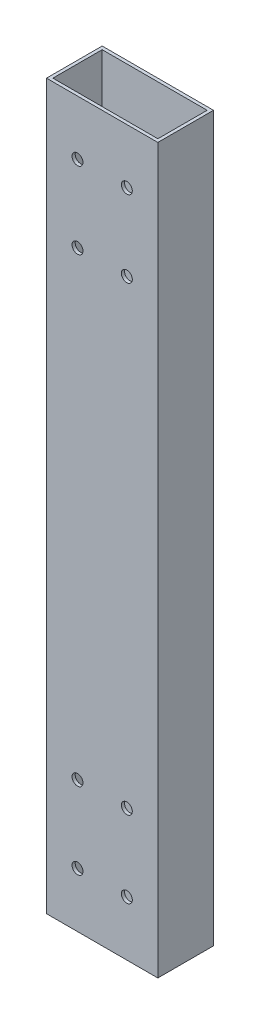
ISO-10303-21;
HEADER;
FILE_DESCRIPTION(('STEP AP214'),'2;1');
FILE_NAME('part.step','',(''),(''),'','','');
FILE_SCHEMA(('AUTOMOTIVE_DESIGN { 1 0 10303 214 1 1 1 1 }'));
ENDSEC;
DATA;
#1=APPLICATION_CONTEXT('core data for automotive mechanical design processes');
#2=APPLICATION_PROTOCOL_DEFINITION('international standard','automotive_design',2000,#1);
#3=PRODUCT_CONTEXT('',#1,'mechanical');
#4=PRODUCT('Part','Part','',(#3));
#5=PRODUCT_RELATED_PRODUCT_CATEGORY('part','',(#4));
#6=PRODUCT_DEFINITION_FORMATION('','',#4);
#7=PRODUCT_DEFINITION_CONTEXT('part definition',#1,'design');
#8=PRODUCT_DEFINITION('design','',#6,#7);
#9=PRODUCT_DEFINITION_SHAPE('','',#8);
#10=(LENGTH_UNIT() NAMED_UNIT(*) SI_UNIT(.MILLI.,.METRE.));
#11=(NAMED_UNIT(*) PLANE_ANGLE_UNIT() SI_UNIT($,.RADIAN.));
#12=(NAMED_UNIT(*) SI_UNIT($,.STERADIAN.) SOLID_ANGLE_UNIT());
#13=UNCERTAINTY_MEASURE_WITH_UNIT(LENGTH_MEASURE(1.E-05),#10,'distance_accuracy_value','');
#14=(GEOMETRIC_REPRESENTATION_CONTEXT(3) GLOBAL_UNCERTAINTY_ASSIGNED_CONTEXT((#13)) GLOBAL_UNIT_ASSIGNED_CONTEXT((#10,
#11,#12)) REPRESENTATION_CONTEXT('',''));
#15=CARTESIAN_POINT('',(0.,0.,0.));
#16=DIRECTION('',(0.,0.,1.));
#17=DIRECTION('',(1.,0.,0.));
#18=AXIS2_PLACEMENT_3D('',#15,#16,#17);
#19=CARTESIAN_POINT('',(0.,330.2,0.));
#20=DIRECTION('',(0.,-1.,0.));
#21=DIRECTION('',(0.,0.,-1.));
#22=AXIS2_PLACEMENT_3D('',#19,#20,#21);
#23=PLANE('',#22);
#24=DIRECTION('',(0.,0.,-1.));
#25=VECTOR('',#24,1.);
#26=CARTESIAN_POINT('',(25.4,330.2,12.7));
#27=LINE('',#26,#25);
#28=CARTESIAN_POINT('',(25.4,330.2,12.7));
#29=VERTEX_POINT('',#28);
#30=CARTESIAN_POINT('',(25.4,330.2,-12.7));
#31=VERTEX_POINT('',#30);
#32=EDGE_CURVE('E163',#29,#31,#27,.T.);
#33=ORIENTED_EDGE('',*,*,#32,.T.);
#34=DIRECTION('',(-1.,0.,0.));
#35=VECTOR('',#34,1.);
#36=CARTESIAN_POINT('',(-25.4,330.2,-12.7));
#37=LINE('',#36,#35);
#38=CARTESIAN_POINT('',(-25.4,330.2,-12.7));
#39=VERTEX_POINT('',#38);
#40=EDGE_CURVE('E167',#31,#39,#37,.T.);
#41=ORIENTED_EDGE('',*,*,#40,.T.);
#42=DIRECTION('',(0.,0.,1.));
#43=VECTOR('',#42,1.);
#44=CARTESIAN_POINT('',(-25.4,330.2,12.7));
#45=LINE('',#44,#43);
#46=CARTESIAN_POINT('',(-25.4,330.2,12.7));
#47=VERTEX_POINT('',#46);
#48=EDGE_CURVE('E171',#39,#47,#45,.T.);
#49=ORIENTED_EDGE('',*,*,#48,.T.);
#50=DIRECTION('',(1.,0.,0.));
#51=VECTOR('',#50,1.);
#52=CARTESIAN_POINT('',(-25.4,330.2,12.7));
#53=LINE('',#52,#51);
#54=EDGE_CURVE('E174',#47,#29,#53,.T.);
#55=ORIENTED_EDGE('',*,*,#54,.T.);
#56=EDGE_LOOP('',(#33,#41,#49,#55));
#57=FACE_BOUND('',#56,.T.);
#58=DIRECTION('',(0.,0.,1.));
#59=VECTOR('',#58,1.);
#60=CARTESIAN_POINT('',(-23.95,330.2,11.25));
#61=LINE('',#60,#59);
#62=CARTESIAN_POINT('',(-23.95,330.2,-11.25));
#63=VERTEX_POINT('',#62);
#64=CARTESIAN_POINT('',(-23.95,330.2,11.25));
#65=VERTEX_POINT('',#64);
#66=EDGE_CURVE('E113',#63,#65,#61,.T.);
#67=ORIENTED_EDGE('',*,*,#66,.F.);
#68=DIRECTION('',(-1.,0.,0.));
#69=VECTOR('',#68,1.);
#70=CARTESIAN_POINT('',(-23.95,330.2,-11.25));
#71=LINE('',#70,#69);
#72=CARTESIAN_POINT('',(23.95,330.2,-11.25));
#73=VERTEX_POINT('',#72);
#74=EDGE_CURVE('E139',#73,#63,#71,.T.);
#75=ORIENTED_EDGE('',*,*,#74,.F.);
#76=DIRECTION('',(0.,0.,-1.));
#77=VECTOR('',#76,1.);
#78=CARTESIAN_POINT('',(23.95,330.2,11.25));
#79=LINE('',#78,#77);
#80=CARTESIAN_POINT('',(23.95,330.2,11.25));
#81=VERTEX_POINT('',#80);
#82=EDGE_CURVE('E135',#81,#73,#79,.T.);
#83=ORIENTED_EDGE('',*,*,#82,.F.);
#84=DIRECTION('',(1.,0.,0.));
#85=VECTOR('',#84,1.);
#86=CARTESIAN_POINT('',(-23.95,330.2,11.25));
#87=LINE('',#86,#85);
#88=EDGE_CURVE('E122',#65,#81,#87,.T.);
#89=ORIENTED_EDGE('',*,*,#88,.F.);
#90=EDGE_LOOP('',(#67,#75,#83,#89));
#91=FACE_BOUND('',#90,.T.);
#92=ADVANCED_FACE('F45',(#57,#91),#23,.F.);
#93=CARTESIAN_POINT('',(0.,0.,0.));
#94=DIRECTION('',(0.,-1.,0.));
#95=DIRECTION('',(0.,0.,-1.));
#96=AXIS2_PLACEMENT_3D('',#93,#94,#95);
#97=PLANE('',#96);
#98=DIRECTION('',(0.,0.,-1.));
#99=VECTOR('',#98,1.);
#100=CARTESIAN_POINT('',(25.4,0.,12.7));
#101=LINE('',#100,#99);
#102=CARTESIAN_POINT('',(25.4,0.,12.7));
#103=VERTEX_POINT('',#102);
#104=CARTESIAN_POINT('',(25.4,0.,-12.7));
#105=VERTEX_POINT('',#104);
#106=EDGE_CURVE('E131',#103,#105,#101,.T.);
#107=ORIENTED_EDGE('',*,*,#106,.F.);
#108=DIRECTION('',(1.,0.,0.));
#109=VECTOR('',#108,1.);
#110=CARTESIAN_POINT('',(-25.4,0.,12.7));
#111=LINE('',#110,#109);
#112=CARTESIAN_POINT('',(-25.4,0.,12.7));
#113=VERTEX_POINT('',#112);
#114=EDGE_CURVE('E168',#113,#103,#111,.T.);
#115=ORIENTED_EDGE('',*,*,#114,.F.);
#116=DIRECTION('',(0.,0.,1.));
#117=VECTOR('',#116,1.);
#118=CARTESIAN_POINT('',(-25.4,0.,12.7));
#119=LINE('',#118,#117);
#120=CARTESIAN_POINT('',(-25.4,0.,-12.7));
#121=VERTEX_POINT('',#120);
#122=EDGE_CURVE('E184',#121,#113,#119,.T.);
#123=ORIENTED_EDGE('',*,*,#122,.F.);
#124=DIRECTION('',(-1.,0.,0.));
#125=VECTOR('',#124,1.);
#126=CARTESIAN_POINT('',(-25.4,0.,-12.7));
#127=LINE('',#126,#125);
#128=EDGE_CURVE('E181',#105,#121,#127,.T.);
#129=ORIENTED_EDGE('',*,*,#128,.F.);
#130=EDGE_LOOP('',(#107,#115,#123,#129));
#131=FACE_BOUND('',#130,.T.);
#132=DIRECTION('',(-1.,0.,0.));
#133=VECTOR('',#132,1.);
#134=CARTESIAN_POINT('',(-23.95,0.,-11.25));
#135=LINE('',#134,#133);
#136=CARTESIAN_POINT('',(23.95,0.,-11.25));
#137=VERTEX_POINT('',#136);
#138=CARTESIAN_POINT('',(-23.95,0.,-11.25));
#139=VERTEX_POINT('',#138);
#140=EDGE_CURVE('E123',#137,#139,#135,.T.);
#141=ORIENTED_EDGE('',*,*,#140,.T.);
#142=DIRECTION('',(0.,0.,1.));
#143=VECTOR('',#142,1.);
#144=CARTESIAN_POINT('',(-23.95,0.,11.25));
#145=LINE('',#144,#143);
#146=CARTESIAN_POINT('',(-23.95,0.,11.25));
#147=VERTEX_POINT('',#146);
#148=EDGE_CURVE('E71',#139,#147,#145,.T.);
#149=ORIENTED_EDGE('',*,*,#148,.T.);
#150=DIRECTION('',(1.,0.,0.));
#151=VECTOR('',#150,1.);
#152=CARTESIAN_POINT('',(-23.95,0.,11.25));
#153=LINE('',#152,#151);
#154=CARTESIAN_POINT('',(23.95,0.,11.25));
#155=VERTEX_POINT('',#154);
#156=EDGE_CURVE('E129',#147,#155,#153,.T.);
#157=ORIENTED_EDGE('',*,*,#156,.T.);
#158=DIRECTION('',(0.,0.,-1.));
#159=VECTOR('',#158,1.);
#160=CARTESIAN_POINT('',(23.95,0.,11.25));
#161=LINE('',#160,#159);
#162=EDGE_CURVE('E150',#155,#137,#161,.T.);
#163=ORIENTED_EDGE('',*,*,#162,.T.);
#164=EDGE_LOOP('',(#141,#149,#157,#163));
#165=FACE_BOUND('',#164,.T.);
#166=ADVANCED_FACE('F332',(#131,#165),#97,.T.);
#167=CARTESIAN_POINT('',(25.4,330.2,12.7));
#168=DIRECTION('',(-1.,0.,0.));
#169=DIRECTION('',(0.,0.,1.));
#170=AXIS2_PLACEMENT_3D('',#167,#168,#169);
#171=PLANE('',#170);
#172=ORIENTED_EDGE('',*,*,#106,.T.);
#173=DIRECTION('',(0.,-1.,0.));
#174=VECTOR('',#173,1.);
#175=CARTESIAN_POINT('',(25.4,330.2,-12.7));
#176=LINE('',#175,#174);
#177=EDGE_CURVE('E11',#31,#105,#176,.T.);
#178=ORIENTED_EDGE('',*,*,#177,.F.);
#179=ORIENTED_EDGE('',*,*,#32,.F.);
#180=DIRECTION('',(0.,-1.,0.));
#181=VECTOR('',#180,1.);
#182=CARTESIAN_POINT('',(25.4,330.2,12.7));
#183=LINE('',#182,#181);
#184=EDGE_CURVE('E177',#29,#103,#183,.T.);
#185=ORIENTED_EDGE('',*,*,#184,.T.);
#186=EDGE_LOOP('',(#172,#178,#179,#185));
#187=FACE_BOUND('',#186,.T.);
#188=ADVANCED_FACE('F47',(#187),#171,.F.);
#189=CARTESIAN_POINT('',(-25.4,330.2,-12.7));
#190=DIRECTION('',(0.,0.,1.));
#191=DIRECTION('',(1.,0.,0.));
#192=AXIS2_PLACEMENT_3D('',#189,#190,#191);
#193=PLANE('',#192);
#194=CARTESIAN_POINT('',(11.25,305.2,-12.7));
#195=DIRECTION('',(0.,0.,-1.));
#196=DIRECTION('',(1.,0.,0.));
#197=AXIS2_PLACEMENT_3D('',#194,#195,#196);
#198=CIRCLE('',#197,2.5);
#199=CARTESIAN_POINT('',(13.75,305.2,-12.7));
#200=VERTEX_POINT('',#199);
#201=EDGE_CURVE('E429',#200,#200,#198,.T.);
#202=ORIENTED_EDGE('',*,*,#201,.F.);
#203=EDGE_LOOP('',(#202));
#204=FACE_BOUND('',#203,.T.);
#205=CARTESIAN_POINT('',(-11.25,305.2,-12.7));
#206=DIRECTION('',(0.,0.,-1.));
#207=DIRECTION('',(1.,0.,0.));
#208=AXIS2_PLACEMENT_3D('',#205,#206,#207);
#209=CIRCLE('',#208,2.5);
#210=CARTESIAN_POINT('',(-8.75,305.2,-12.7));
#211=VERTEX_POINT('',#210);
#212=EDGE_CURVE('E415',#211,#211,#209,.T.);
#213=ORIENTED_EDGE('',*,*,#212,.F.);
#214=EDGE_LOOP('',(#213));
#215=FACE_BOUND('',#214,.T.);
#216=CARTESIAN_POINT('',(-11.25,270.2,-12.7));
#217=DIRECTION('',(0.,0.,-1.));
#218=DIRECTION('',(1.,0.,0.));
#219=AXIS2_PLACEMENT_3D('',#216,#217,#218);
#220=CIRCLE('',#219,2.5);
#221=CARTESIAN_POINT('',(-8.75,270.2,-12.7));
#222=VERTEX_POINT('',#221);
#223=EDGE_CURVE('E414',#222,#222,#220,.T.);
#224=ORIENTED_EDGE('',*,*,#223,.F.);
#225=EDGE_LOOP('',(#224));
#226=FACE_BOUND('',#225,.T.);
#227=CARTESIAN_POINT('',(11.25,270.2,-12.7));
#228=DIRECTION('',(0.,0.,-1.));
#229=DIRECTION('',(1.,0.,0.));
#230=AXIS2_PLACEMENT_3D('',#227,#228,#229);
#231=CIRCLE('',#230,2.5);
#232=CARTESIAN_POINT('',(13.75,270.2,-12.7));
#233=VERTEX_POINT('',#232);
#234=EDGE_CURVE('E224',#233,#233,#231,.T.);
#235=ORIENTED_EDGE('',*,*,#234,.F.);
#236=EDGE_LOOP('',(#235));
#237=FACE_BOUND('',#236,.T.);
#238=CARTESIAN_POINT('',(11.25,25.,-12.7));
#239=DIRECTION('',(0.,0.,1.));
#240=DIRECTION('',(1.,0.,0.));
#241=AXIS2_PLACEMENT_3D('',#238,#239,#240);
#242=CIRCLE('',#241,2.5);
#243=CARTESIAN_POINT('',(13.75,25.,-12.7));
#244=VERTEX_POINT('',#243);
#245=EDGE_CURVE('E250',#244,#244,#242,.T.);
#246=ORIENTED_EDGE('',*,*,#245,.T.);
#247=EDGE_LOOP('',(#246));
#248=FACE_BOUND('',#247,.T.);
#249=CARTESIAN_POINT('',(-11.25,25.,-12.7));
#250=DIRECTION('',(0.,0.,1.));
#251=DIRECTION('',(1.,0.,0.));
#252=AXIS2_PLACEMENT_3D('',#249,#250,#251);
#253=CIRCLE('',#252,2.5);
#254=CARTESIAN_POINT('',(-8.75,25.,-12.7));
#255=VERTEX_POINT('',#254);
#256=EDGE_CURVE('E264',#255,#255,#253,.T.);
#257=ORIENTED_EDGE('',*,*,#256,.T.);
#258=EDGE_LOOP('',(#257));
#259=FACE_BOUND('',#258,.T.);
#260=CARTESIAN_POINT('',(-11.25,60.,-12.7));
#261=DIRECTION('',(0.,0.,1.));
#262=DIRECTION('',(1.,0.,0.));
#263=AXIS2_PLACEMENT_3D('',#260,#261,#262);
#264=CIRCLE('',#263,2.5);
#265=CARTESIAN_POINT('',(-8.75,60.,-12.7));
#266=VERTEX_POINT('',#265);
#267=EDGE_CURVE('E256',#266,#266,#264,.T.);
#268=ORIENTED_EDGE('',*,*,#267,.T.);
#269=EDGE_LOOP('',(#268));
#270=FACE_BOUND('',#269,.T.);
#271=CARTESIAN_POINT('',(11.25,60.,-12.7));
#272=DIRECTION('',(0.,0.,1.));
#273=DIRECTION('',(1.,0.,0.));
#274=AXIS2_PLACEMENT_3D('',#271,#272,#273);
#275=CIRCLE('',#274,2.5);
#276=CARTESIAN_POINT('',(13.75,60.,-12.7));
#277=VERTEX_POINT('',#276);
#278=EDGE_CURVE('E204',#277,#277,#275,.T.);
#279=ORIENTED_EDGE('',*,*,#278,.T.);
#280=EDGE_LOOP('',(#279));
#281=FACE_BOUND('',#280,.T.);
#282=ORIENTED_EDGE('',*,*,#128,.T.);
#283=DIRECTION('',(0.,-1.,0.));
#284=VECTOR('',#283,1.);
#285=CARTESIAN_POINT('',(-25.4,330.2,-12.7));
#286=LINE('',#285,#284);
#287=EDGE_CURVE('E55',#39,#121,#286,.T.);
#288=ORIENTED_EDGE('',*,*,#287,.F.);
#289=ORIENTED_EDGE('',*,*,#40,.F.);
#290=ORIENTED_EDGE('',*,*,#177,.T.);
#291=EDGE_LOOP('',(#282,#288,#289,#290));
#292=FACE_BOUND('',#291,.T.);
#293=ADVANCED_FACE('F336',(#204,#215,#226,#237,#248,#259,#270,#281,#292),#193,.F.);
#294=CARTESIAN_POINT('',(-25.4,330.2,12.7));
#295=DIRECTION('',(1.,0.,0.));
#296=DIRECTION('',(0.,0.,-1.));
#297=AXIS2_PLACEMENT_3D('',#294,#295,#296);
#298=PLANE('',#297);
#299=ORIENTED_EDGE('',*,*,#122,.T.);
#300=DIRECTION('',(0.,-1.,0.));
#301=VECTOR('',#300,1.);
#302=CARTESIAN_POINT('',(-25.4,330.2,12.7));
#303=LINE('',#302,#301);
#304=EDGE_CURVE('E192',#47,#113,#303,.T.);
#305=ORIENTED_EDGE('',*,*,#304,.F.);
#306=ORIENTED_EDGE('',*,*,#48,.F.);
#307=ORIENTED_EDGE('',*,*,#287,.T.);
#308=EDGE_LOOP('',(#299,#305,#306,#307));
#309=FACE_BOUND('',#308,.T.);
#310=ADVANCED_FACE('F319',(#309),#298,.F.);
#311=CARTESIAN_POINT('',(-25.4,330.2,12.7));
#312=DIRECTION('',(0.,0.,-1.));
#313=DIRECTION('',(-1.,0.,0.));
#314=AXIS2_PLACEMENT_3D('',#311,#312,#313);
#315=PLANE('',#314);
#316=CARTESIAN_POINT('',(11.25,305.2,12.7));
#317=DIRECTION('',(0.,0.,-1.));
#318=DIRECTION('',(1.,0.,0.));
#319=AXIS2_PLACEMENT_3D('',#316,#317,#318);
#320=CIRCLE('',#319,2.5);
#321=CARTESIAN_POINT('',(13.75,305.2,12.7));
#322=VERTEX_POINT('',#321);
#323=EDGE_CURVE('E433',#322,#322,#320,.T.);
#324=ORIENTED_EDGE('',*,*,#323,.T.);
#325=EDGE_LOOP('',(#324));
#326=FACE_BOUND('',#325,.T.);
#327=CARTESIAN_POINT('',(-11.25,305.2,12.7));
#328=DIRECTION('',(0.,0.,-1.));
#329=DIRECTION('',(1.,0.,0.));
#330=AXIS2_PLACEMENT_3D('',#327,#328,#329);
#331=CIRCLE('',#330,2.5);
#332=CARTESIAN_POINT('',(-8.75,305.2,12.7));
#333=VERTEX_POINT('',#332);
#334=EDGE_CURVE('E423',#333,#333,#331,.T.);
#335=ORIENTED_EDGE('',*,*,#334,.T.);
#336=EDGE_LOOP('',(#335));
#337=FACE_BOUND('',#336,.T.);
#338=CARTESIAN_POINT('',(-11.25,270.2,12.7));
#339=DIRECTION('',(0.,0.,-1.));
#340=DIRECTION('',(1.,0.,0.));
#341=AXIS2_PLACEMENT_3D('',#338,#339,#340);
#342=CIRCLE('',#341,2.5);
#343=CARTESIAN_POINT('',(-8.75,270.2,12.7));
#344=VERTEX_POINT('',#343);
#345=EDGE_CURVE('E411',#344,#344,#342,.T.);
#346=ORIENTED_EDGE('',*,*,#345,.T.);
#347=EDGE_LOOP('',(#346));
#348=FACE_BOUND('',#347,.T.);
#349=CARTESIAN_POINT('',(11.25,270.2,12.7));
#350=DIRECTION('',(0.,0.,-1.));
#351=DIRECTION('',(1.,0.,0.));
#352=AXIS2_PLACEMENT_3D('',#349,#350,#351);
#353=CIRCLE('',#352,2.5);
#354=CARTESIAN_POINT('',(13.75,270.2,12.7));
#355=VERTEX_POINT('',#354);
#356=EDGE_CURVE('E420',#355,#355,#353,.T.);
#357=ORIENTED_EDGE('',*,*,#356,.T.);
#358=EDGE_LOOP('',(#357));
#359=FACE_BOUND('',#358,.T.);
#360=CARTESIAN_POINT('',(11.25,25.,12.7));
#361=DIRECTION('',(0.,0.,1.));
#362=DIRECTION('',(1.,0.,0.));
#363=AXIS2_PLACEMENT_3D('',#360,#361,#362);
#364=CIRCLE('',#363,2.5);
#365=CARTESIAN_POINT('',(13.75,25.,12.7));
#366=VERTEX_POINT('',#365);
#367=EDGE_CURVE('E268',#366,#366,#364,.T.);
#368=ORIENTED_EDGE('',*,*,#367,.F.);
#369=EDGE_LOOP('',(#368));
#370=FACE_BOUND('',#369,.T.);
#371=CARTESIAN_POINT('',(-11.25,25.,12.7));
#372=DIRECTION('',(0.,0.,1.));
#373=DIRECTION('',(1.,0.,0.));
#374=AXIS2_PLACEMENT_3D('',#371,#372,#373);
#375=CIRCLE('',#374,2.5);
#376=CARTESIAN_POINT('',(-8.75,25.,12.7));
#377=VERTEX_POINT('',#376);
#378=EDGE_CURVE('E260',#377,#377,#375,.T.);
#379=ORIENTED_EDGE('',*,*,#378,.F.);
#380=EDGE_LOOP('',(#379));
#381=FACE_BOUND('',#380,.T.);
#382=CARTESIAN_POINT('',(-11.25,60.,12.7));
#383=DIRECTION('',(0.,0.,1.));
#384=DIRECTION('',(1.,0.,0.));
#385=AXIS2_PLACEMENT_3D('',#382,#383,#384);
#386=CIRCLE('',#385,2.5);
#387=CARTESIAN_POINT('',(-8.75,60.,12.7));
#388=VERTEX_POINT('',#387);
#389=EDGE_CURVE('E251',#388,#388,#386,.T.);
#390=ORIENTED_EDGE('',*,*,#389,.F.);
#391=EDGE_LOOP('',(#390));
#392=FACE_BOUND('',#391,.T.);
#393=CARTESIAN_POINT('',(11.25,60.,12.7));
#394=DIRECTION('',(0.,0.,1.));
#395=DIRECTION('',(1.,0.,0.));
#396=AXIS2_PLACEMENT_3D('',#393,#394,#395);
#397=CIRCLE('',#396,2.5);
#398=CARTESIAN_POINT('',(13.75,60.,12.7));
#399=VERTEX_POINT('',#398);
#400=EDGE_CURVE('E255',#399,#399,#397,.T.);
#401=ORIENTED_EDGE('',*,*,#400,.F.);
#402=EDGE_LOOP('',(#401));
#403=FACE_BOUND('',#402,.T.);
#404=ORIENTED_EDGE('',*,*,#114,.T.);
#405=ORIENTED_EDGE('',*,*,#184,.F.);
#406=ORIENTED_EDGE('',*,*,#54,.F.);
#407=ORIENTED_EDGE('',*,*,#304,.T.);
#408=EDGE_LOOP('',(#404,#405,#406,#407));
#409=FACE_BOUND('',#408,.T.);
#410=ADVANCED_FACE('F316',(#326,#337,#348,#359,#370,#381,#392,#403,#409),#315,.F.);
#411=CARTESIAN_POINT('',(-23.95,330.2,11.25));
#412=DIRECTION('',(1.,0.,0.));
#413=DIRECTION('',(0.,0.,-1.));
#414=AXIS2_PLACEMENT_3D('',#411,#412,#413);
#415=PLANE('',#414);
#416=ORIENTED_EDGE('',*,*,#148,.F.);
#417=DIRECTION('',(0.,-1.,0.));
#418=VECTOR('',#417,1.);
#419=CARTESIAN_POINT('',(-23.95,330.2,-11.25));
#420=LINE('',#419,#418);
#421=EDGE_CURVE('E117',#63,#139,#420,.T.);
#422=ORIENTED_EDGE('',*,*,#421,.F.);
#423=ORIENTED_EDGE('',*,*,#66,.T.);
#424=DIRECTION('',(0.,-1.,0.));
#425=VECTOR('',#424,1.);
#426=CARTESIAN_POINT('',(-23.95,330.2,11.25));
#427=LINE('',#426,#425);
#428=EDGE_CURVE('E116',#65,#147,#427,.T.);
#429=ORIENTED_EDGE('',*,*,#428,.T.);
#430=EDGE_LOOP('',(#416,#422,#423,#429));
#431=FACE_BOUND('',#430,.T.);
#432=ADVANCED_FACE('F115',(#431),#415,.T.);
#433=CARTESIAN_POINT('',(-23.95,330.2,11.25));
#434=DIRECTION('',(0.,0.,-1.));
#435=DIRECTION('',(-1.,0.,0.));
#436=AXIS2_PLACEMENT_3D('',#433,#434,#435);
#437=PLANE('',#436);
#438=CARTESIAN_POINT('',(11.25,305.2,11.25));
#439=DIRECTION('',(0.,0.,-1.));
#440=DIRECTION('',(-1.,0.,0.));
#441=AXIS2_PLACEMENT_3D('',#438,#439,#440);
#442=CIRCLE('',#441,2.5);
#443=CARTESIAN_POINT('',(8.75,305.2,11.25));
#444=VERTEX_POINT('',#443);
#445=EDGE_CURVE('E246',#444,#444,#442,.F.);
#446=ORIENTED_EDGE('',*,*,#445,.T.);
#447=EDGE_LOOP('',(#446));
#448=FACE_BOUND('',#447,.T.);
#449=CARTESIAN_POINT('',(-11.25,305.2,11.25));
#450=DIRECTION('',(0.,0.,-1.));
#451=DIRECTION('',(-1.,0.,0.));
#452=AXIS2_PLACEMENT_3D('',#449,#450,#451);
#453=CIRCLE('',#452,2.5);
#454=CARTESIAN_POINT('',(-13.75,305.2,11.25));
#455=VERTEX_POINT('',#454);
#456=EDGE_CURVE('E232',#455,#455,#453,.F.);
#457=ORIENTED_EDGE('',*,*,#456,.T.);
#458=EDGE_LOOP('',(#457));
#459=FACE_BOUND('',#458,.T.);
#460=CARTESIAN_POINT('',(-11.25,270.2,11.25));
#461=DIRECTION('',(0.,0.,-1.));
#462=DIRECTION('',(-1.,0.,0.));
#463=AXIS2_PLACEMENT_3D('',#460,#461,#462);
#464=CIRCLE('',#463,2.5);
#465=CARTESIAN_POINT('',(-13.75,270.2,11.25));
#466=VERTEX_POINT('',#465);
#467=EDGE_CURVE('E228',#466,#466,#464,.F.);
#468=ORIENTED_EDGE('',*,*,#467,.T.);
#469=EDGE_LOOP('',(#468));
#470=FACE_BOUND('',#469,.T.);
#471=CARTESIAN_POINT('',(11.25,270.2,11.25));
#472=DIRECTION('',(0.,0.,-1.));
#473=DIRECTION('',(-1.,0.,0.));
#474=AXIS2_PLACEMENT_3D('',#471,#472,#473);
#475=CIRCLE('',#474,2.5);
#476=CARTESIAN_POINT('',(8.75,270.2,11.25));
#477=VERTEX_POINT('',#476);
#478=EDGE_CURVE('E223',#477,#477,#475,.F.);
#479=ORIENTED_EDGE('',*,*,#478,.T.);
#480=EDGE_LOOP('',(#479));
#481=FACE_BOUND('',#480,.T.);
#482=CARTESIAN_POINT('',(11.25,25.,11.25));
#483=DIRECTION('',(0.,0.,-1.));
#484=DIRECTION('',(-1.,0.,0.));
#485=AXIS2_PLACEMENT_3D('',#482,#483,#484);
#486=CIRCLE('',#485,2.5);
#487=CARTESIAN_POINT('',(8.75,25.,11.25));
#488=VERTEX_POINT('',#487);
#489=EDGE_CURVE('E147',#488,#488,#486,.T.);
#490=ORIENTED_EDGE('',*,*,#489,.F.);
#491=EDGE_LOOP('',(#490));
#492=FACE_BOUND('',#491,.T.);
#493=CARTESIAN_POINT('',(-11.25,25.,11.25));
#494=DIRECTION('',(0.,0.,-1.));
#495=DIRECTION('',(-1.,0.,0.));
#496=AXIS2_PLACEMENT_3D('',#493,#494,#495);
#497=CIRCLE('',#496,2.5);
#498=CARTESIAN_POINT('',(-13.75,25.,11.25));
#499=VERTEX_POINT('',#498);
#500=EDGE_CURVE('E214',#499,#499,#497,.T.);
#501=ORIENTED_EDGE('',*,*,#500,.F.);
#502=EDGE_LOOP('',(#501));
#503=FACE_BOUND('',#502,.T.);
#504=CARTESIAN_POINT('',(-11.25,60.,11.25));
#505=DIRECTION('',(0.,0.,-1.));
#506=DIRECTION('',(-1.,0.,0.));
#507=AXIS2_PLACEMENT_3D('',#504,#505,#506);
#508=CIRCLE('',#507,2.5);
#509=CARTESIAN_POINT('',(-13.75,60.,11.25));
#510=VERTEX_POINT('',#509);
#511=EDGE_CURVE('E209',#510,#510,#508,.T.);
#512=ORIENTED_EDGE('',*,*,#511,.F.);
#513=EDGE_LOOP('',(#512));
#514=FACE_BOUND('',#513,.T.);
#515=CARTESIAN_POINT('',(11.25,60.,11.25));
#516=DIRECTION('',(0.,0.,-1.));
#517=DIRECTION('',(-1.,0.,0.));
#518=AXIS2_PLACEMENT_3D('',#515,#516,#517);
#519=CIRCLE('',#518,2.5);
#520=CARTESIAN_POINT('',(8.75,60.,11.25));
#521=VERTEX_POINT('',#520);
#522=EDGE_CURVE('E203',#521,#521,#519,.T.);
#523=ORIENTED_EDGE('',*,*,#522,.F.);
#524=EDGE_LOOP('',(#523));
#525=FACE_BOUND('',#524,.T.);
#526=ORIENTED_EDGE('',*,*,#156,.F.);
#527=ORIENTED_EDGE('',*,*,#428,.F.);
#528=ORIENTED_EDGE('',*,*,#88,.T.);
#529=DIRECTION('',(0.,-1.,0.));
#530=VECTOR('',#529,1.);
#531=CARTESIAN_POINT('',(23.95,330.2,11.25));
#532=LINE('',#531,#530);
#533=EDGE_CURVE('E132',#81,#155,#532,.T.);
#534=ORIENTED_EDGE('',*,*,#533,.T.);
#535=EDGE_LOOP('',(#526,#527,#528,#534));
#536=FACE_BOUND('',#535,.T.);
#537=ADVANCED_FACE('F126',(#448,#459,#470,#481,#492,#503,#514,#525,#536),#437,.T.);
#538=CARTESIAN_POINT('',(23.95,330.2,11.25));
#539=DIRECTION('',(-1.,0.,0.));
#540=DIRECTION('',(0.,0.,1.));
#541=AXIS2_PLACEMENT_3D('',#538,#539,#540);
#542=PLANE('',#541);
#543=ORIENTED_EDGE('',*,*,#162,.F.);
#544=ORIENTED_EDGE('',*,*,#533,.F.);
#545=ORIENTED_EDGE('',*,*,#82,.T.);
#546=DIRECTION('',(0.,-1.,0.));
#547=VECTOR('',#546,1.);
#548=CARTESIAN_POINT('',(23.95,330.2,-11.25));
#549=LINE('',#548,#547);
#550=EDGE_CURVE('E63',#73,#137,#549,.T.);
#551=ORIENTED_EDGE('',*,*,#550,.T.);
#552=EDGE_LOOP('',(#543,#544,#545,#551));
#553=FACE_BOUND('',#552,.T.);
#554=ADVANCED_FACE('F298',(#553),#542,.T.);
#555=CARTESIAN_POINT('',(-23.95,330.2,-11.25));
#556=DIRECTION('',(0.,0.,1.));
#557=DIRECTION('',(1.,0.,0.));
#558=AXIS2_PLACEMENT_3D('',#555,#556,#557);
#559=PLANE('',#558);
#560=CARTESIAN_POINT('',(11.25,305.2,-11.25));
#561=DIRECTION('',(0.,0.,1.));
#562=DIRECTION('',(1.,0.,0.));
#563=AXIS2_PLACEMENT_3D('',#560,#561,#562);
#564=CIRCLE('',#563,2.5);
#565=CARTESIAN_POINT('',(13.75,305.2,-11.25));
#566=VERTEX_POINT('',#565);
#567=EDGE_CURVE('E49',#566,#566,#564,.F.);
#568=ORIENTED_EDGE('',*,*,#567,.T.);
#569=EDGE_LOOP('',(#568));
#570=FACE_BOUND('',#569,.T.);
#571=CARTESIAN_POINT('',(-11.25,305.2,-11.25));
#572=DIRECTION('',(0.,0.,1.));
#573=DIRECTION('',(1.,0.,0.));
#574=AXIS2_PLACEMENT_3D('',#571,#572,#573);
#575=CIRCLE('',#574,2.5);
#576=CARTESIAN_POINT('',(-8.75,305.2,-11.25));
#577=VERTEX_POINT('',#576);
#578=EDGE_CURVE('E229',#577,#577,#575,.F.);
#579=ORIENTED_EDGE('',*,*,#578,.T.);
#580=EDGE_LOOP('',(#579));
#581=FACE_BOUND('',#580,.T.);
#582=CARTESIAN_POINT('',(-11.25,270.2,-11.25));
#583=DIRECTION('',(0.,0.,1.));
#584=DIRECTION('',(1.,0.,0.));
#585=AXIS2_PLACEMENT_3D('',#582,#583,#584);
#586=CIRCLE('',#585,2.5);
#587=CARTESIAN_POINT('',(-8.75,270.2,-11.25));
#588=VERTEX_POINT('',#587);
#589=EDGE_CURVE('E225',#588,#588,#586,.F.);
#590=ORIENTED_EDGE('',*,*,#589,.T.);
#591=EDGE_LOOP('',(#590));
#592=FACE_BOUND('',#591,.T.);
#593=CARTESIAN_POINT('',(11.25,270.2,-11.25));
#594=DIRECTION('',(0.,0.,1.));
#595=DIRECTION('',(1.,0.,0.));
#596=AXIS2_PLACEMENT_3D('',#593,#594,#595);
#597=CIRCLE('',#596,2.5);
#598=CARTESIAN_POINT('',(13.75,270.2,-11.25));
#599=VERTEX_POINT('',#598);
#600=EDGE_CURVE('E219',#599,#599,#597,.F.);
#601=ORIENTED_EDGE('',*,*,#600,.T.);
#602=EDGE_LOOP('',(#601));
#603=FACE_BOUND('',#602,.T.);
#604=CARTESIAN_POINT('',(11.25,25.,-11.25));
#605=DIRECTION('',(0.,0.,1.));
#606=DIRECTION('',(1.,0.,0.));
#607=AXIS2_PLACEMENT_3D('',#604,#605,#606);
#608=CIRCLE('',#607,2.5);
#609=CARTESIAN_POINT('',(13.75,25.,-11.25));
#610=VERTEX_POINT('',#609);
#611=EDGE_CURVE('E215',#610,#610,#608,.T.);
#612=ORIENTED_EDGE('',*,*,#611,.F.);
#613=EDGE_LOOP('',(#612));
#614=FACE_BOUND('',#613,.T.);
#615=CARTESIAN_POINT('',(-11.25,25.,-11.25));
#616=DIRECTION('',(0.,0.,1.));
#617=DIRECTION('',(1.,0.,0.));
#618=AXIS2_PLACEMENT_3D('',#615,#616,#617);
#619=CIRCLE('',#618,2.5);
#620=CARTESIAN_POINT('',(-8.75,25.,-11.25));
#621=VERTEX_POINT('',#620);
#622=EDGE_CURVE('E210',#621,#621,#619,.T.);
#623=ORIENTED_EDGE('',*,*,#622,.F.);
#624=EDGE_LOOP('',(#623));
#625=FACE_BOUND('',#624,.T.);
#626=CARTESIAN_POINT('',(-11.25,60.,-11.25));
#627=DIRECTION('',(0.,0.,1.));
#628=DIRECTION('',(1.,0.,0.));
#629=AXIS2_PLACEMENT_3D('',#626,#627,#628);
#630=CIRCLE('',#629,2.5);
#631=CARTESIAN_POINT('',(-8.75,60.,-11.25));
#632=VERTEX_POINT('',#631);
#633=EDGE_CURVE('E205',#632,#632,#630,.T.);
#634=ORIENTED_EDGE('',*,*,#633,.F.);
#635=EDGE_LOOP('',(#634));
#636=FACE_BOUND('',#635,.T.);
#637=CARTESIAN_POINT('',(11.25,60.,-11.25));
#638=DIRECTION('',(0.,0.,1.));
#639=DIRECTION('',(1.,0.,0.));
#640=AXIS2_PLACEMENT_3D('',#637,#638,#639);
#641=CIRCLE('',#640,2.5);
#642=CARTESIAN_POINT('',(13.75,60.,-11.25));
#643=VERTEX_POINT('',#642);
#644=EDGE_CURVE('E199',#643,#643,#641,.T.);
#645=ORIENTED_EDGE('',*,*,#644,.F.);
#646=EDGE_LOOP('',(#645));
#647=FACE_BOUND('',#646,.T.);
#648=ORIENTED_EDGE('',*,*,#140,.F.);
#649=ORIENTED_EDGE('',*,*,#550,.F.);
#650=ORIENTED_EDGE('',*,*,#74,.T.);
#651=ORIENTED_EDGE('',*,*,#421,.T.);
#652=EDGE_LOOP('',(#648,#649,#650,#651));
#653=FACE_BOUND('',#652,.T.);
#654=ADVANCED_FACE('F358',(#570,#581,#592,#603,#614,#625,#636,#647,#653),#559,.T.);
#655=CARTESIAN_POINT('',(11.25,60.,-12.7));
#656=DIRECTION('',(0.,0.,1.));
#657=DIRECTION('',(1.,0.,0.));
#658=AXIS2_PLACEMENT_3D('',#655,#656,#657);
#659=CYLINDRICAL_SURFACE('',#658,2.5);
#660=ORIENTED_EDGE('',*,*,#644,.T.);
#661=EDGE_LOOP('',(#660));
#662=FACE_BOUND('',#661,.T.);
#663=ORIENTED_EDGE('',*,*,#278,.F.);
#664=EDGE_LOOP('',(#663));
#665=FACE_BOUND('',#664,.T.);
#666=ADVANCED_FACE('F313',(#662,#665),#659,.F.);
#667=CARTESIAN_POINT('',(-11.25,60.,-12.7));
#668=DIRECTION('',(0.,0.,1.));
#669=DIRECTION('',(1.,0.,0.));
#670=AXIS2_PLACEMENT_3D('',#667,#668,#669);
#671=CYLINDRICAL_SURFACE('',#670,2.5);
#672=ORIENTED_EDGE('',*,*,#633,.T.);
#673=EDGE_LOOP('',(#672));
#674=FACE_BOUND('',#673,.T.);
#675=ORIENTED_EDGE('',*,*,#267,.F.);
#676=EDGE_LOOP('',(#675));
#677=FACE_BOUND('',#676,.T.);
#678=ADVANCED_FACE('F364',(#674,#677),#671,.F.);
#679=CARTESIAN_POINT('',(-11.25,25.,-12.7));
#680=DIRECTION('',(0.,0.,1.));
#681=DIRECTION('',(1.,0.,0.));
#682=AXIS2_PLACEMENT_3D('',#679,#680,#681);
#683=CYLINDRICAL_SURFACE('',#682,2.5);
#684=ORIENTED_EDGE('',*,*,#622,.T.);
#685=EDGE_LOOP('',(#684));
#686=FACE_BOUND('',#685,.T.);
#687=ORIENTED_EDGE('',*,*,#256,.F.);
#688=EDGE_LOOP('',(#687));
#689=FACE_BOUND('',#688,.T.);
#690=ADVANCED_FACE('F368',(#686,#689),#683,.F.);
#691=CARTESIAN_POINT('',(11.25,25.,-12.7));
#692=DIRECTION('',(0.,0.,1.));
#693=DIRECTION('',(1.,0.,0.));
#694=AXIS2_PLACEMENT_3D('',#691,#692,#693);
#695=CYLINDRICAL_SURFACE('',#694,2.5);
#696=ORIENTED_EDGE('',*,*,#611,.T.);
#697=EDGE_LOOP('',(#696));
#698=FACE_BOUND('',#697,.T.);
#699=ORIENTED_EDGE('',*,*,#245,.F.);
#700=EDGE_LOOP('',(#699));
#701=FACE_BOUND('',#700,.T.);
#702=ADVANCED_FACE('F311',(#698,#701),#695,.F.);
#703=ORIENTED_EDGE('',*,*,#522,.T.);
#704=EDGE_LOOP('',(#703));
#705=FACE_BOUND('',#704,.T.);
#706=ORIENTED_EDGE('',*,*,#400,.T.);
#707=EDGE_LOOP('',(#706));
#708=FACE_BOUND('',#707,.T.);
#709=ADVANCED_FACE('F307',(#705,#708),#659,.F.);
#710=ORIENTED_EDGE('',*,*,#511,.T.);
#711=EDGE_LOOP('',(#710));
#712=FACE_BOUND('',#711,.T.);
#713=ORIENTED_EDGE('',*,*,#389,.T.);
#714=EDGE_LOOP('',(#713));
#715=FACE_BOUND('',#714,.T.);
#716=ADVANCED_FACE('F310',(#712,#715),#671,.F.);
#717=ORIENTED_EDGE('',*,*,#500,.T.);
#718=EDGE_LOOP('',(#717));
#719=FACE_BOUND('',#718,.T.);
#720=ORIENTED_EDGE('',*,*,#378,.T.);
#721=EDGE_LOOP('',(#720));
#722=FACE_BOUND('',#721,.T.);
#723=ADVANCED_FACE('F373',(#719,#722),#683,.F.);
#724=ORIENTED_EDGE('',*,*,#489,.T.);
#725=EDGE_LOOP('',(#724));
#726=FACE_BOUND('',#725,.T.);
#727=ORIENTED_EDGE('',*,*,#367,.T.);
#728=EDGE_LOOP('',(#727));
#729=FACE_BOUND('',#728,.T.);
#730=ADVANCED_FACE('F293',(#726,#729),#695,.F.);
#731=CARTESIAN_POINT('',(11.25,270.2,-12.7));
#732=DIRECTION('',(0.,0.,1.));
#733=DIRECTION('',(1.,0.,0.));
#734=AXIS2_PLACEMENT_3D('',#731,#732,#733);
#735=CYLINDRICAL_SURFACE('',#734,2.5);
#736=ORIENTED_EDGE('',*,*,#600,.F.);
#737=EDGE_LOOP('',(#736));
#738=FACE_BOUND('',#737,.T.);
#739=ORIENTED_EDGE('',*,*,#234,.T.);
#740=EDGE_LOOP('',(#739));
#741=FACE_BOUND('',#740,.T.);
#742=ADVANCED_FACE('F377',(#738,#741),#735,.F.);
#743=CARTESIAN_POINT('',(-11.25,270.2,-12.7));
#744=DIRECTION('',(0.,0.,1.));
#745=DIRECTION('',(1.,0.,0.));
#746=AXIS2_PLACEMENT_3D('',#743,#744,#745);
#747=CYLINDRICAL_SURFACE('',#746,2.5);
#748=ORIENTED_EDGE('',*,*,#589,.F.);
#749=EDGE_LOOP('',(#748));
#750=FACE_BOUND('',#749,.T.);
#751=ORIENTED_EDGE('',*,*,#223,.T.);
#752=EDGE_LOOP('',(#751));
#753=FACE_BOUND('',#752,.T.);
#754=ADVANCED_FACE('F380',(#750,#753),#747,.F.);
#755=CARTESIAN_POINT('',(-11.25,305.2,-12.7));
#756=DIRECTION('',(0.,0.,1.));
#757=DIRECTION('',(1.,0.,0.));
#758=AXIS2_PLACEMENT_3D('',#755,#756,#757);
#759=CYLINDRICAL_SURFACE('',#758,2.5);
#760=ORIENTED_EDGE('',*,*,#578,.F.);
#761=EDGE_LOOP('',(#760));
#762=FACE_BOUND('',#761,.T.);
#763=ORIENTED_EDGE('',*,*,#212,.T.);
#764=EDGE_LOOP('',(#763));
#765=FACE_BOUND('',#764,.T.);
#766=ADVANCED_FACE('F386',(#762,#765),#759,.F.);
#767=CARTESIAN_POINT('',(11.25,305.2,-12.7));
#768=DIRECTION('',(0.,0.,1.));
#769=DIRECTION('',(1.,0.,0.));
#770=AXIS2_PLACEMENT_3D('',#767,#768,#769);
#771=CYLINDRICAL_SURFACE('',#770,2.5);
#772=ORIENTED_EDGE('',*,*,#567,.F.);
#773=EDGE_LOOP('',(#772));
#774=FACE_BOUND('',#773,.T.);
#775=ORIENTED_EDGE('',*,*,#201,.T.);
#776=EDGE_LOOP('',(#775));
#777=FACE_BOUND('',#776,.T.);
#778=ADVANCED_FACE('F383',(#774,#777),#771,.F.);
#779=ORIENTED_EDGE('',*,*,#478,.F.);
#780=EDGE_LOOP('',(#779));
#781=FACE_BOUND('',#780,.T.);
#782=ORIENTED_EDGE('',*,*,#356,.F.);
#783=EDGE_LOOP('',(#782));
#784=FACE_BOUND('',#783,.T.);
#785=ADVANCED_FACE('F382',(#781,#784),#735,.F.);
#786=ORIENTED_EDGE('',*,*,#467,.F.);
#787=EDGE_LOOP('',(#786));
#788=FACE_BOUND('',#787,.T.);
#789=ORIENTED_EDGE('',*,*,#345,.F.);
#790=EDGE_LOOP('',(#789));
#791=FACE_BOUND('',#790,.T.);
#792=ADVANCED_FACE('F395',(#788,#791),#747,.F.);
#793=ORIENTED_EDGE('',*,*,#456,.F.);
#794=EDGE_LOOP('',(#793));
#795=FACE_BOUND('',#794,.T.);
#796=ORIENTED_EDGE('',*,*,#334,.F.);
#797=EDGE_LOOP('',(#796));
#798=FACE_BOUND('',#797,.T.);
#799=ADVANCED_FACE('F392',(#795,#798),#759,.F.);
#800=ORIENTED_EDGE('',*,*,#445,.F.);
#801=EDGE_LOOP('',(#800));
#802=FACE_BOUND('',#801,.T.);
#803=ORIENTED_EDGE('',*,*,#323,.F.);
#804=EDGE_LOOP('',(#803));
#805=FACE_BOUND('',#804,.T.);
#806=ADVANCED_FACE('F388',(#802,#805),#771,.F.);
#807=CLOSED_SHELL('',(#92,#166,#188,#293,#310,#410,#432,#537,#554,#654,#666,#678,#690,#702,#709,
#716,#723,#730,#742,#754,#766,#778,#785,#792,#799,#806));
#808=MANIFOLD_SOLID_BREP('B2',#807);
#809=ADVANCED_BREP_SHAPE_REPRESENTATION('',(#18,#808),#14);
#810=SHAPE_DEFINITION_REPRESENTATION(#9,#809);
ENDSEC;
END-ISO-10303-21;
